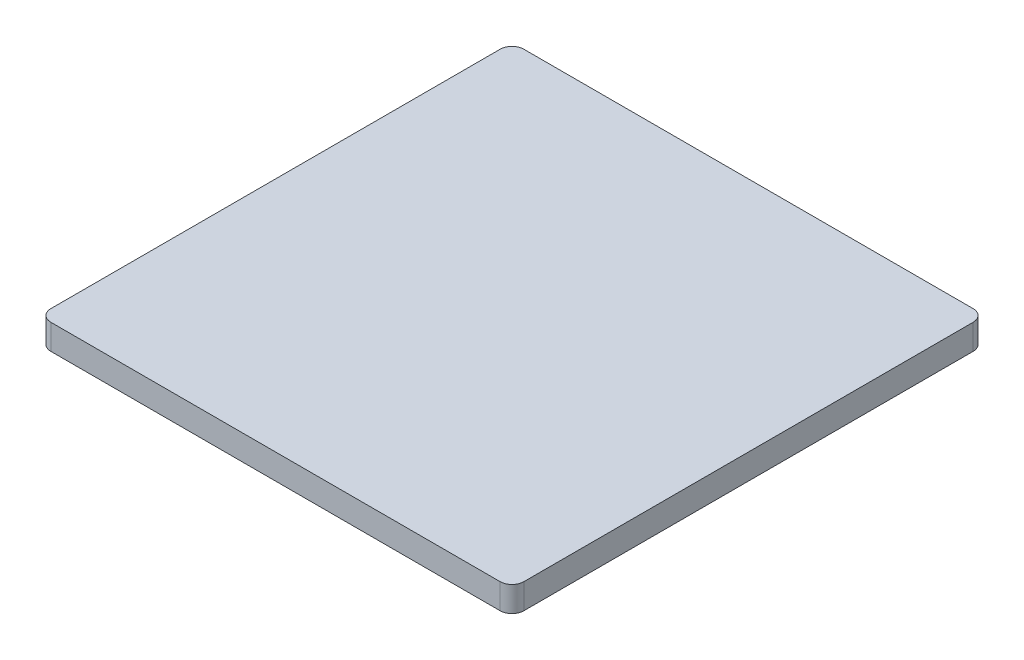
ISO-10303-21;
HEADER;
FILE_DESCRIPTION(('STEP AP214'),'2;1');
FILE_NAME('part.step','',(''),(''),'','','');
FILE_SCHEMA(('AUTOMOTIVE_DESIGN { 1 0 10303 214 1 1 1 1 }'));
ENDSEC;
DATA;
#1=APPLICATION_CONTEXT('core data for automotive mechanical design processes');
#2=APPLICATION_PROTOCOL_DEFINITION('international standard','automotive_design',2000,#1);
#3=PRODUCT_CONTEXT('',#1,'mechanical');
#4=PRODUCT('Part','Part','',(#3));
#5=PRODUCT_RELATED_PRODUCT_CATEGORY('part','',(#4));
#6=PRODUCT_DEFINITION_FORMATION('','',#4);
#7=PRODUCT_DEFINITION_CONTEXT('part definition',#1,'design');
#8=PRODUCT_DEFINITION('design','',#6,#7);
#9=PRODUCT_DEFINITION_SHAPE('','',#8);
#10=(LENGTH_UNIT() NAMED_UNIT(*) SI_UNIT(.MILLI.,.METRE.));
#11=(NAMED_UNIT(*) PLANE_ANGLE_UNIT() SI_UNIT($,.RADIAN.));
#12=(NAMED_UNIT(*) SI_UNIT($,.STERADIAN.) SOLID_ANGLE_UNIT());
#13=UNCERTAINTY_MEASURE_WITH_UNIT(LENGTH_MEASURE(1.E-05),#10,'distance_accuracy_value','');
#14=(GEOMETRIC_REPRESENTATION_CONTEXT(3) GLOBAL_UNCERTAINTY_ASSIGNED_CONTEXT((#13)) GLOBAL_UNIT_ASSIGNED_CONTEXT((#10,
#11,#12)) REPRESENTATION_CONTEXT('',''));
#15=CARTESIAN_POINT('',(0.,0.,0.));
#16=DIRECTION('',(0.,0.,1.));
#17=DIRECTION('',(1.,0.,0.));
#18=AXIS2_PLACEMENT_3D('',#15,#16,#17);
#19=CARTESIAN_POINT('',(-55.4430411002877,1.6,22.0311616479623));
#20=DIRECTION('',(1.,0.,0.));
#21=DIRECTION('',(0.,0.,-1.));
#22=AXIS2_PLACEMENT_3D('',#19,#20,#21);
#23=PLANE('',#22);
#24=DIRECTION('',(0.,0.,1.));
#25=VECTOR('',#24,1.);
#26=CARTESIAN_POINT('',(-55.4430411002877,0.,22.0311616479623));
#27=LINE('',#26,#25);
#28=CARTESIAN_POINT('',(-55.4430411002877,0.,22.7811616479623));
#29=VERTEX_POINT('',#28);
#30=CARTESIAN_POINT('',(-55.4430411002877,0.,51.2811616479623));
#31=VERTEX_POINT('',#30);
#32=EDGE_CURVE('E158',#29,#31,#27,.T.);
#33=ORIENTED_EDGE('',*,*,#32,.T.);
#34=DIRECTION('',(0.,-1.,0.));
#35=VECTOR('',#34,1.);
#36=CARTESIAN_POINT('',(-55.4430411002877,1.6,51.2811616479623));
#37=LINE('',#36,#35);
#38=CARTESIAN_POINT('',(-55.4430411002877,1.6,51.2811616479623));
#39=VERTEX_POINT('',#38);
#40=EDGE_CURVE('E11',#31,#39,#37,.F.);
#41=ORIENTED_EDGE('',*,*,#40,.T.);
#42=DIRECTION('',(0.,0.,1.));
#43=VECTOR('',#42,1.);
#44=CARTESIAN_POINT('',(-55.4430411002877,1.6,22.0311616479623));
#45=LINE('',#44,#43);
#46=CARTESIAN_POINT('',(-55.4430411002877,1.6,22.7811616479623));
#47=VERTEX_POINT('',#46);
#48=EDGE_CURVE('E126',#47,#39,#45,.T.);
#49=ORIENTED_EDGE('',*,*,#48,.F.);
#50=DIRECTION('',(0.,-1.,0.));
#51=VECTOR('',#50,1.);
#52=CARTESIAN_POINT('',(-55.4430411002877,1.6,22.7811616479623));
#53=LINE('',#52,#51);
#54=EDGE_CURVE('E42',#47,#29,#53,.T.);
#55=ORIENTED_EDGE('',*,*,#54,.T.);
#56=EDGE_LOOP('',(#33,#41,#49,#55));
#57=FACE_BOUND('',#56,.T.);
#58=ADVANCED_FACE('F34',(#57),#23,.F.);
#59=CARTESIAN_POINT('',(-55.4430411002877,1.6,52.0311616479623));
#60=DIRECTION('',(0.,0.,-1.));
#61=DIRECTION('',(-1.,0.,0.));
#62=AXIS2_PLACEMENT_3D('',#59,#60,#61);
#63=PLANE('',#62);
#64=DIRECTION('',(1.,0.,0.));
#65=VECTOR('',#64,1.);
#66=CARTESIAN_POINT('',(-55.4430411002877,1.6,52.0311616479623));
#67=LINE('',#66,#65);
#68=CARTESIAN_POINT('',(-54.6930411002877,1.6,52.0311616479623));
#69=VERTEX_POINT('',#68);
#70=CARTESIAN_POINT('',(-26.1930411002877,1.6,52.0311616479623));
#71=VERTEX_POINT('',#70);
#72=EDGE_CURVE('E129',#69,#71,#67,.T.);
#73=ORIENTED_EDGE('',*,*,#72,.F.);
#74=DIRECTION('',(0.,-1.,0.));
#75=VECTOR('',#74,1.);
#76=CARTESIAN_POINT('',(-54.6930411002877,1.6,52.0311616479623));
#77=LINE('',#76,#75);
#78=CARTESIAN_POINT('',(-54.6930411002877,0.,52.0311616479623));
#79=VERTEX_POINT('',#78);
#80=EDGE_CURVE('E151',#69,#79,#77,.T.);
#81=ORIENTED_EDGE('',*,*,#80,.T.);
#82=DIRECTION('',(1.,0.,0.));
#83=VECTOR('',#82,1.);
#84=CARTESIAN_POINT('',(-55.4430411002877,0.,52.0311616479623));
#85=LINE('',#84,#83);
#86=CARTESIAN_POINT('',(-26.1930411002877,0.,52.0311616479623));
#87=VERTEX_POINT('',#86);
#88=EDGE_CURVE('E131',#79,#87,#85,.T.);
#89=ORIENTED_EDGE('',*,*,#88,.T.);
#90=DIRECTION('',(0.,-1.,0.));
#91=VECTOR('',#90,1.);
#92=CARTESIAN_POINT('',(-26.1930411002877,1.6,52.0311616479623));
#93=LINE('',#92,#91);
#94=EDGE_CURVE('E49',#87,#71,#93,.F.);
#95=ORIENTED_EDGE('',*,*,#94,.T.);
#96=EDGE_LOOP('',(#73,#81,#89,#95));
#97=FACE_BOUND('',#96,.T.);
#98=ADVANCED_FACE('F178',(#97),#63,.F.);
#99=CARTESIAN_POINT('',(-25.4430411002877,1.6,22.0311616479623));
#100=DIRECTION('',(-1.,0.,0.));
#101=DIRECTION('',(0.,0.,1.));
#102=AXIS2_PLACEMENT_3D('',#99,#100,#101);
#103=PLANE('',#102);
#104=DIRECTION('',(0.,0.,-1.));
#105=VECTOR('',#104,1.);
#106=CARTESIAN_POINT('',(-25.4430411002877,0.,22.0311616479623));
#107=LINE('',#106,#105);
#108=CARTESIAN_POINT('',(-25.4430411002877,0.,51.2811616479623));
#109=VERTEX_POINT('',#108);
#110=CARTESIAN_POINT('',(-25.4430411002877,0.,22.7811616479623));
#111=VERTEX_POINT('',#110);
#112=EDGE_CURVE('E127',#109,#111,#107,.T.);
#113=ORIENTED_EDGE('',*,*,#112,.T.);
#114=DIRECTION('',(0.,-1.,0.));
#115=VECTOR('',#114,1.);
#116=CARTESIAN_POINT('',(-25.4430411002877,1.6,22.7811616479623));
#117=LINE('',#116,#115);
#118=CARTESIAN_POINT('',(-25.4430411002877,1.6,22.7811616479623));
#119=VERTEX_POINT('',#118);
#120=EDGE_CURVE('E105',#111,#119,#117,.F.);
#121=ORIENTED_EDGE('',*,*,#120,.T.);
#122=DIRECTION('',(0.,0.,-1.));
#123=VECTOR('',#122,1.);
#124=CARTESIAN_POINT('',(-25.4430411002877,1.6,22.0311616479623));
#125=LINE('',#124,#123);
#126=CARTESIAN_POINT('',(-25.4430411002877,1.6,51.2811616479623));
#127=VERTEX_POINT('',#126);
#128=EDGE_CURVE('E166',#127,#119,#125,.T.);
#129=ORIENTED_EDGE('',*,*,#128,.F.);
#130=DIRECTION('',(0.,-1.,0.));
#131=VECTOR('',#130,1.);
#132=CARTESIAN_POINT('',(-25.4430411002877,1.6,51.2811616479623));
#133=LINE('',#132,#131);
#134=EDGE_CURVE('E110',#127,#109,#133,.T.);
#135=ORIENTED_EDGE('',*,*,#134,.T.);
#136=EDGE_LOOP('',(#113,#121,#129,#135));
#137=FACE_BOUND('',#136,.T.);
#138=ADVANCED_FACE('F177',(#137),#103,.F.);
#139=CARTESIAN_POINT('',(-55.4430411002877,1.6,22.0311616479623));
#140=DIRECTION('',(0.,0.,1.));
#141=DIRECTION('',(1.,0.,0.));
#142=AXIS2_PLACEMENT_3D('',#139,#140,#141);
#143=PLANE('',#142);
#144=DIRECTION('',(-1.,0.,0.));
#145=VECTOR('',#144,1.);
#146=CARTESIAN_POINT('',(-55.4430411002877,1.6,22.0311616479623));
#147=LINE('',#146,#145);
#148=CARTESIAN_POINT('',(-26.1930411002877,1.6,22.0311616479623));
#149=VERTEX_POINT('',#148);
#150=CARTESIAN_POINT('',(-54.6930411002877,1.6,22.0311616479623));
#151=VERTEX_POINT('',#150);
#152=EDGE_CURVE('E120',#149,#151,#147,.T.);
#153=ORIENTED_EDGE('',*,*,#152,.F.);
#154=DIRECTION('',(0.,-1.,0.));
#155=VECTOR('',#154,1.);
#156=CARTESIAN_POINT('',(-26.1930411002877,1.6,22.0311616479623));
#157=LINE('',#156,#155);
#158=CARTESIAN_POINT('',(-26.1930411002877,0.,22.0311616479623));
#159=VERTEX_POINT('',#158);
#160=EDGE_CURVE('E104',#149,#159,#157,.T.);
#161=ORIENTED_EDGE('',*,*,#160,.T.);
#162=DIRECTION('',(-1.,0.,0.));
#163=VECTOR('',#162,1.);
#164=CARTESIAN_POINT('',(-55.4430411002877,0.,22.0311616479623));
#165=LINE('',#164,#163);
#166=CARTESIAN_POINT('',(-54.6930411002877,0.,22.0311616479623));
#167=VERTEX_POINT('',#166);
#168=EDGE_CURVE('E117',#159,#167,#165,.T.);
#169=ORIENTED_EDGE('',*,*,#168,.T.);
#170=DIRECTION('',(0.,-1.,0.));
#171=VECTOR('',#170,1.);
#172=CARTESIAN_POINT('',(-54.6930411002877,1.6,22.0311616479623));
#173=LINE('',#172,#171);
#174=EDGE_CURVE('E122',#167,#151,#173,.F.);
#175=ORIENTED_EDGE('',*,*,#174,.T.);
#176=EDGE_LOOP('',(#153,#161,#169,#175));
#177=FACE_BOUND('',#176,.T.);
#178=ADVANCED_FACE('F116',(#177),#143,.F.);
#179=CARTESIAN_POINT('',(0.,1.6,0.));
#180=DIRECTION('',(0.,1.,0.));
#181=DIRECTION('',(0.,0.,1.));
#182=AXIS2_PLACEMENT_3D('',#179,#180,#181);
#183=PLANE('',#182);
#184=ORIENTED_EDGE('',*,*,#128,.T.);
#185=CARTESIAN_POINT('',(-26.1930411002877,1.6,22.7811616479623));
#186=DIRECTION('',(0.,1.,0.));
#187=DIRECTION('',(0.,0.,1.));
#188=AXIS2_PLACEMENT_3D('',#185,#186,#187);
#189=CIRCLE('',#188,0.75);
#190=EDGE_CURVE('E148',#119,#149,#189,.T.);
#191=ORIENTED_EDGE('',*,*,#190,.T.);
#192=ORIENTED_EDGE('',*,*,#152,.T.);
#193=CARTESIAN_POINT('',(-54.6930411002877,1.6,22.7811616479623));
#194=DIRECTION('',(0.,1.,0.));
#195=DIRECTION('',(0.,0.,1.));
#196=AXIS2_PLACEMENT_3D('',#193,#194,#195);
#197=CIRCLE('',#196,0.75);
#198=EDGE_CURVE('E143',#151,#47,#197,.T.);
#199=ORIENTED_EDGE('',*,*,#198,.T.);
#200=ORIENTED_EDGE('',*,*,#48,.T.);
#201=CARTESIAN_POINT('',(-54.6930411002877,1.6,51.2811616479623));
#202=DIRECTION('',(0.,1.,0.));
#203=DIRECTION('',(0.,0.,1.));
#204=AXIS2_PLACEMENT_3D('',#201,#202,#203);
#205=CIRCLE('',#204,0.75);
#206=EDGE_CURVE('E56',#39,#69,#205,.T.);
#207=ORIENTED_EDGE('',*,*,#206,.T.);
#208=ORIENTED_EDGE('',*,*,#72,.T.);
#209=CARTESIAN_POINT('',(-26.1930411002877,1.6,51.2811616479623));
#210=DIRECTION('',(0.,1.,0.));
#211=DIRECTION('',(0.,0.,1.));
#212=AXIS2_PLACEMENT_3D('',#209,#210,#211);
#213=CIRCLE('',#212,0.75);
#214=EDGE_CURVE('E145',#71,#127,#213,.T.);
#215=ORIENTED_EDGE('',*,*,#214,.T.);
#216=EDGE_LOOP('',(#184,#191,#192,#199,#200,#207,#208,#215));
#217=FACE_BOUND('',#216,.T.);
#218=ADVANCED_FACE('F170',(#217),#183,.T.);
#219=CARTESIAN_POINT('',(0.,0.,0.));
#220=DIRECTION('',(0.,1.,0.));
#221=DIRECTION('',(0.,0.,1.));
#222=AXIS2_PLACEMENT_3D('',#219,#220,#221);
#223=PLANE('',#222);
#224=ORIENTED_EDGE('',*,*,#168,.F.);
#225=CARTESIAN_POINT('',(-26.1930411002877,0.,22.7811616479623));
#226=DIRECTION('',(0.,1.,0.));
#227=DIRECTION('',(0.,0.,1.));
#228=AXIS2_PLACEMENT_3D('',#225,#226,#227);
#229=CIRCLE('',#228,0.75);
#230=EDGE_CURVE('E100',#159,#111,#229,.F.);
#231=ORIENTED_EDGE('',*,*,#230,.T.);
#232=ORIENTED_EDGE('',*,*,#112,.F.);
#233=CARTESIAN_POINT('',(-26.1930411002877,0.,51.2811616479623));
#234=DIRECTION('',(0.,1.,0.));
#235=DIRECTION('',(0.,0.,1.));
#236=AXIS2_PLACEMENT_3D('',#233,#234,#235);
#237=CIRCLE('',#236,0.75);
#238=EDGE_CURVE('E137',#109,#87,#237,.F.);
#239=ORIENTED_EDGE('',*,*,#238,.T.);
#240=ORIENTED_EDGE('',*,*,#88,.F.);
#241=CARTESIAN_POINT('',(-54.6930411002877,0.,51.2811616479623));
#242=DIRECTION('',(0.,1.,0.));
#243=DIRECTION('',(0.,0.,1.));
#244=AXIS2_PLACEMENT_3D('',#241,#242,#243);
#245=CIRCLE('',#244,0.75);
#246=EDGE_CURVE('E111',#79,#31,#245,.F.);
#247=ORIENTED_EDGE('',*,*,#246,.T.);
#248=ORIENTED_EDGE('',*,*,#32,.F.);
#249=CARTESIAN_POINT('',(-54.6930411002877,0.,22.7811616479623));
#250=DIRECTION('',(0.,1.,0.));
#251=DIRECTION('',(0.,0.,1.));
#252=AXIS2_PLACEMENT_3D('',#249,#250,#251);
#253=CIRCLE('',#252,0.75);
#254=EDGE_CURVE('E121',#29,#167,#253,.F.);
#255=ORIENTED_EDGE('',*,*,#254,.T.);
#256=EDGE_LOOP('',(#224,#231,#232,#239,#240,#247,#248,#255));
#257=FACE_BOUND('',#256,.T.);
#258=ADVANCED_FACE('F124',(#257),#223,.F.);
#259=CARTESIAN_POINT('',(-26.1930411002877,1.6,22.7811616479623));
#260=DIRECTION('',(0.,-1.,0.));
#261=DIRECTION('',(0.,0.,-1.));
#262=AXIS2_PLACEMENT_3D('',#259,#260,#261);
#263=CYLINDRICAL_SURFACE('',#262,0.75);
#264=ORIENTED_EDGE('',*,*,#190,.F.);
#265=ORIENTED_EDGE('',*,*,#120,.F.);
#266=ORIENTED_EDGE('',*,*,#230,.F.);
#267=ORIENTED_EDGE('',*,*,#160,.F.);
#268=EDGE_LOOP('',(#264,#265,#266,#267));
#269=FACE_BOUND('',#268,.T.);
#270=ADVANCED_FACE('F103',(#269),#263,.T.);
#271=CARTESIAN_POINT('',(-54.6930411002877,1.6,51.2811616479623));
#272=DIRECTION('',(0.,-1.,0.));
#273=DIRECTION('',(0.,0.,-1.));
#274=AXIS2_PLACEMENT_3D('',#271,#272,#273);
#275=CYLINDRICAL_SURFACE('',#274,0.75);
#276=ORIENTED_EDGE('',*,*,#206,.F.);
#277=ORIENTED_EDGE('',*,*,#40,.F.);
#278=ORIENTED_EDGE('',*,*,#246,.F.);
#279=ORIENTED_EDGE('',*,*,#80,.F.);
#280=EDGE_LOOP('',(#276,#277,#278,#279));
#281=FACE_BOUND('',#280,.T.);
#282=ADVANCED_FACE('F180',(#281),#275,.T.);
#283=CARTESIAN_POINT('',(-26.1930411002877,1.6,51.2811616479623));
#284=DIRECTION('',(0.,-1.,0.));
#285=DIRECTION('',(0.,0.,-1.));
#286=AXIS2_PLACEMENT_3D('',#283,#284,#285);
#287=CYLINDRICAL_SURFACE('',#286,0.75);
#288=ORIENTED_EDGE('',*,*,#214,.F.);
#289=ORIENTED_EDGE('',*,*,#94,.F.);
#290=ORIENTED_EDGE('',*,*,#238,.F.);
#291=ORIENTED_EDGE('',*,*,#134,.F.);
#292=EDGE_LOOP('',(#288,#289,#290,#291));
#293=FACE_BOUND('',#292,.T.);
#294=ADVANCED_FACE('F175',(#293),#287,.T.);
#295=CARTESIAN_POINT('',(-54.6930411002877,1.6,22.7811616479623));
#296=DIRECTION('',(0.,-1.,0.));
#297=DIRECTION('',(0.,0.,-1.));
#298=AXIS2_PLACEMENT_3D('',#295,#296,#297);
#299=CYLINDRICAL_SURFACE('',#298,0.75);
#300=ORIENTED_EDGE('',*,*,#198,.F.);
#301=ORIENTED_EDGE('',*,*,#174,.F.);
#302=ORIENTED_EDGE('',*,*,#254,.F.);
#303=ORIENTED_EDGE('',*,*,#54,.F.);
#304=EDGE_LOOP('',(#300,#301,#302,#303));
#305=FACE_BOUND('',#304,.T.);
#306=ADVANCED_FACE('F36',(#305),#299,.T.);
#307=CLOSED_SHELL('',(#58,#98,#138,#178,#218,#258,#270,#282,#294,#306));
#308=MANIFOLD_SOLID_BREP('B2',#307);
#309=ADVANCED_BREP_SHAPE_REPRESENTATION('',(#18,#308),#14);
#310=SHAPE_DEFINITION_REPRESENTATION(#9,#309);
ENDSEC;
END-ISO-10303-21;
